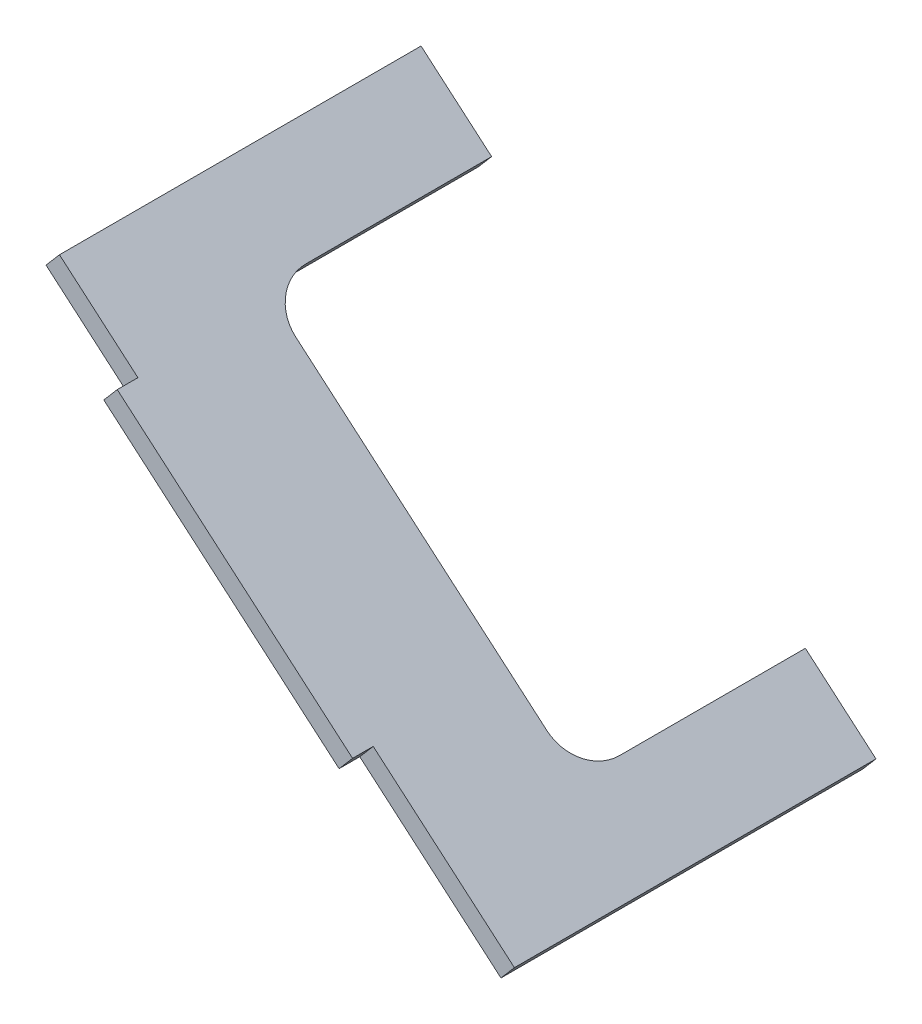
ISO-10303-21;
HEADER;
FILE_DESCRIPTION(('STEP AP214'),'2;1');
FILE_NAME('part.step','',(''),(''),'','','');
FILE_SCHEMA(('AUTOMOTIVE_DESIGN { 1 0 10303 214 1 1 1 1 }'));
ENDSEC;
DATA;
#1=APPLICATION_CONTEXT('core data for automotive mechanical design processes');
#2=APPLICATION_PROTOCOL_DEFINITION('international standard','automotive_design',2000,#1);
#3=PRODUCT_CONTEXT('',#1,'mechanical');
#4=PRODUCT('Part','Part','',(#3));
#5=PRODUCT_RELATED_PRODUCT_CATEGORY('part','',(#4));
#6=PRODUCT_DEFINITION_FORMATION('','',#4);
#7=PRODUCT_DEFINITION_CONTEXT('part definition',#1,'design');
#8=PRODUCT_DEFINITION('design','',#6,#7);
#9=PRODUCT_DEFINITION_SHAPE('','',#8);
#10=(LENGTH_UNIT() NAMED_UNIT(*) SI_UNIT(.MILLI.,.METRE.));
#11=(NAMED_UNIT(*) PLANE_ANGLE_UNIT() SI_UNIT($,.RADIAN.));
#12=(NAMED_UNIT(*) SI_UNIT($,.STERADIAN.) SOLID_ANGLE_UNIT());
#13=UNCERTAINTY_MEASURE_WITH_UNIT(LENGTH_MEASURE(1.E-05),#10,'distance_accuracy_value','');
#14=(GEOMETRIC_REPRESENTATION_CONTEXT(3) GLOBAL_UNCERTAINTY_ASSIGNED_CONTEXT((#13)) GLOBAL_UNIT_ASSIGNED_CONTEXT((#10,
#11,#12)) REPRESENTATION_CONTEXT('',''));
#15=CARTESIAN_POINT('',(0.,0.,0.));
#16=DIRECTION('',(0.,0.,1.));
#17=DIRECTION('',(1.,0.,0.));
#18=AXIS2_PLACEMENT_3D('',#15,#16,#17);
#19=CARTESIAN_POINT('',(-143.999999999999,-1.79066830807706E-12,-35.));
#20=DIRECTION('',(0.,0.,1.));
#21=DIRECTION('',(0.,1.,0.));
#22=AXIS2_PLACEMENT_3D('',#19,#20,#21);
#23=PLANE('',#22);
#24=DIRECTION('',(-0.759272473775862,0.650772856353339,0.));
#25=VECTOR('',#24,1.);
#26=CARTESIAN_POINT('',(30.6663228878355,65.0384694265857,-35.));
#27=LINE('',#26,#25);
#28=CARTESIAN_POINT('',(29.9070504140597,65.6892422829391,-35.));
#29=VERTEX_POINT('',#28);
#30=CARTESIAN_POINT('',(23.0735981500769,71.5461979901191,-35.));
#31=VERTEX_POINT('',#30);
#32=EDGE_CURVE('E246',#29,#31,#27,.T.);
#33=ORIENTED_EDGE('',*,*,#32,.T.);
#34=DIRECTION('',(-0.650772856353339,-0.759272473775862,0.));
#35=VECTOR('',#34,1.);
#36=CARTESIAN_POINT('',(49.9878306813736,102.947685796981,-35.));
#37=LINE('',#36,#35);
#38=CARTESIAN_POINT('',(24.3751438627836,73.0647429376708,-35.));
#39=VERTEX_POINT('',#38);
#40=EDGE_CURVE('E155',#39,#31,#37,.T.);
#41=ORIENTED_EDGE('',*,*,#40,.F.);
#42=DIRECTION('',(0.759272473775862,-0.650772856353339,0.));
#43=VECTOR('',#42,1.);
#44=CARTESIAN_POINT('',(54.746042813818,47.0338286835373,-35.));
#45=LINE('',#44,#43);
#46=CARTESIAN_POINT('',(31.2085961267664,67.2077872304908,-35.));
#47=VERTEX_POINT('',#46);
#48=EDGE_CURVE('E138',#39,#47,#45,.T.);
#49=ORIENTED_EDGE('',*,*,#48,.T.);
#50=DIRECTION('',(0.650772856353339,0.759272473775862,0.));
#51=VECTOR('',#50,1.);
#52=CARTESIAN_POINT('',(-76.2014777581834,-58.1101508348213,-35.));
#53=LINE('',#52,#51);
#54=EDGE_CURVE('E144',#29,#47,#53,.T.);
#55=ORIENTED_EDGE('',*,*,#54,.F.);
#56=EDGE_LOOP('',(#33,#41,#49,#55));
#57=FACE_BOUND('',#56,.T.);
#58=ADVANCED_FACE('F35',(#57),#23,.F.);
#59=CARTESIAN_POINT('',(31.9678686005422,66.5570143741374,-66.9779195690136));
#60=DIRECTION('',(0.759272473775864,-0.650772856353336,0.));
#61=DIRECTION('',(0.650772856353336,0.759272473775864,0.));
#62=AXIS2_PLACEMENT_3D('',#59,#60,#61);
#63=PLANE('',#62);
#64=DIRECTION('',(-0.650772856353339,-0.759272473775862,0.));
#65=VECTOR('',#64,1.);
#66=CARTESIAN_POINT('',(57.5805554191322,96.4399572334481,0.));
#67=LINE('',#66,#65);
#68=CARTESIAN_POINT('',(31.9678686005422,66.5570143741374,0.));
#69=VERTEX_POINT('',#68);
#70=CARTESIAN_POINT('',(30.6663228878355,65.0384694265857,0.));
#71=VERTEX_POINT('',#70);
#72=EDGE_CURVE('E199',#69,#71,#67,.T.);
#73=ORIENTED_EDGE('',*,*,#72,.T.);
#74=DIRECTION('',(0.,0.,1.));
#75=VECTOR('',#74,1.);
#76=CARTESIAN_POINT('',(30.6663228878355,65.0384694265857,-66.9779195690136));
#77=LINE('',#76,#75);
#78=CARTESIAN_POINT('',(30.6663228878355,65.0384694265857,1.99999999999999));
#79=VERTEX_POINT('',#78);
#80=EDGE_CURVE('E174',#71,#79,#77,.T.);
#81=ORIENTED_EDGE('',*,*,#80,.T.);
#82=DIRECTION('',(-0.650772856353336,-0.759272473775864,0.));
#83=VECTOR('',#82,1.);
#84=CARTESIAN_POINT('',(31.9678686005422,66.5570143741374,1.99999999999999));
#85=LINE('',#84,#83);
#86=CARTESIAN_POINT('',(31.9678686005422,66.5570143741374,1.99999999999999));
#87=VERTEX_POINT('',#86);
#88=EDGE_CURVE('E163',#87,#79,#85,.T.);
#89=ORIENTED_EDGE('',*,*,#88,.F.);
#90=DIRECTION('',(0.,0.,1.));
#91=VECTOR('',#90,1.);
#92=CARTESIAN_POINT('',(31.9678686005422,66.5570143741374,-66.9779195690136));
#93=LINE('',#92,#91);
#94=EDGE_CURVE('E212',#69,#87,#93,.T.);
#95=ORIENTED_EDGE('',*,*,#94,.F.);
#96=EDGE_LOOP('',(#73,#81,#89,#95));
#97=FACE_BOUND('',#96,.T.);
#98=ADVANCED_FACE('F249',(#97),#63,.F.);
#99=CARTESIAN_POINT('',(30.6663228878355,65.0384694265857,-66.9779195690136));
#100=DIRECTION('',(0.650772856353339,0.759272473775862,0.));
#101=DIRECTION('',(-0.759272473775862,0.650772856353339,0.));
#102=AXIS2_PLACEMENT_3D('',#99,#100,#101);
#103=PLANE('',#102);
#104=DIRECTION('',(0.,0.,1.));
#105=VECTOR('',#104,1.);
#106=CARTESIAN_POINT('',(60.2779493650941,39.6583280288055,-66.9779195690136));
#107=LINE('',#106,#105);
#108=CARTESIAN_POINT('',(60.2779493650942,39.6583280288055,-35.));
#109=VERTEX_POINT('',#108);
#110=CARTESIAN_POINT('',(60.2779493650941,39.6583280288055,-17.));
#111=VERTEX_POINT('',#110);
#112=EDGE_CURVE('E299',#109,#111,#107,.T.);
#113=ORIENTED_EDGE('',*,*,#112,.F.);
#114=CARTESIAN_POINT('',(67.1114016290769,33.8013723216254,-35.));
#115=VERTEX_POINT('',#114);
#116=EDGE_CURVE('E160',#115,#109,#27,.T.);
#117=ORIENTED_EDGE('',*,*,#116,.F.);
#118=DIRECTION('',(0.,0.,-1.));
#119=VECTOR('',#118,1.);
#120=CARTESIAN_POINT('',(67.1114016290769,33.8013723216254,0.));
#121=LINE('',#120,#119);
#122=CARTESIAN_POINT('',(67.1114016290769,33.8013723216254,0.));
#123=VERTEX_POINT('',#122);
#124=EDGE_CURVE('E182',#123,#115,#121,.T.);
#125=ORIENTED_EDGE('',*,*,#124,.F.);
#126=DIRECTION('',(0.759272473775862,-0.650772856353339,0.));
#127=VECTOR('',#126,1.);
#128=CARTESIAN_POINT('',(53.4444971011114,45.5152837359855,0.));
#129=LINE('',#128,#127);
#130=CARTESIAN_POINT('',(53.4444971011114,45.5152837359855,0.));
#131=VERTEX_POINT('',#130);
#132=EDGE_CURVE('E179',#131,#123,#129,.T.);
#133=ORIENTED_EDGE('',*,*,#132,.F.);
#134=DIRECTION('',(0.,0.,1.));
#135=VECTOR('',#134,1.);
#136=CARTESIAN_POINT('',(53.4444971011114,45.5152837359855,-66.9779195690136));
#137=LINE('',#136,#135);
#138=CARTESIAN_POINT('',(53.4444971011114,45.5152837359855,1.99999999999999));
#139=VERTEX_POINT('',#138);
#140=EDGE_CURVE('E170',#131,#139,#137,.T.);
#141=ORIENTED_EDGE('',*,*,#140,.T.);
#142=DIRECTION('',(0.759272473775862,-0.650772856353339,0.));
#143=VECTOR('',#142,1.);
#144=CARTESIAN_POINT('',(30.6663228878355,65.0384694265857,1.99999999999999));
#145=LINE('',#144,#143);
#146=EDGE_CURVE('E227',#79,#139,#145,.T.);
#147=ORIENTED_EDGE('',*,*,#146,.F.);
#148=ORIENTED_EDGE('',*,*,#80,.F.);
#149=DIRECTION('',(0.759272473775862,-0.650772856353338,0.));
#150=VECTOR('',#149,1.);
#151=CARTESIAN_POINT('',(30.6663228878355,65.0384694265857,0.));
#152=LINE('',#151,#150);
#153=CARTESIAN_POINT('',(23.0735981500769,71.5461979901191,0.));
#154=VERTEX_POINT('',#153);
#155=EDGE_CURVE('E203',#154,#71,#152,.T.);
#156=ORIENTED_EDGE('',*,*,#155,.F.);
#157=DIRECTION('',(0.,0.,1.));
#158=VECTOR('',#157,1.);
#159=CARTESIAN_POINT('',(23.0735981500769,71.5461979901191,0.));
#160=LINE('',#159,#158);
#161=EDGE_CURVE('E200',#31,#154,#160,.T.);
#162=ORIENTED_EDGE('',*,*,#161,.F.);
#163=ORIENTED_EDGE('',*,*,#32,.F.);
#164=DIRECTION('',(0.,0.,-1.));
#165=VECTOR('',#164,1.);
#166=CARTESIAN_POINT('',(29.9070504140597,65.689242282939,-66.9779195690136));
#167=LINE('',#166,#165);
#168=CARTESIAN_POINT('',(29.9070504140597,65.689242282939,-17.));
#169=VERTEX_POINT('',#168);
#170=EDGE_CURVE('E147',#169,#29,#167,.T.);
#171=ORIENTED_EDGE('',*,*,#170,.F.);
#172=CARTESIAN_POINT('',(32.9441403091631,63.0861508575257,-17.));
#173=DIRECTION('',(-0.650772856353339,-0.759272473775862,0.));
#174=DIRECTION('',(-0.759272473775862,0.650772856353339,0.));
#175=AXIS2_PLACEMENT_3D('',#172,#173,#174);
#176=CIRCLE('',#175,4.);
#177=CARTESIAN_POINT('',(32.9441403091631,63.0861508575257,-13.));
#178=VERTEX_POINT('',#177);
#179=EDGE_CURVE('E11',#178,#169,#176,.T.);
#180=ORIENTED_EDGE('',*,*,#179,.F.);
#181=DIRECTION('',(-0.759272473775862,0.650772856353339,0.));
#182=VECTOR('',#181,1.);
#183=CARTESIAN_POINT('',(30.6663228878355,65.0384694265857,-13.));
#184=LINE('',#183,#182);
#185=CARTESIAN_POINT('',(57.2408594699907,42.2614194542188,-13.));
#186=VERTEX_POINT('',#185);
#187=EDGE_CURVE('E183',#186,#178,#184,.T.);
#188=ORIENTED_EDGE('',*,*,#187,.F.);
#189=CARTESIAN_POINT('',(57.2408594699907,42.2614194542188,-17.));
#190=DIRECTION('',(-0.650772856353339,-0.759272473775862,0.));
#191=DIRECTION('',(-0.759272473775862,0.650772856353339,0.));
#192=AXIS2_PLACEMENT_3D('',#189,#190,#191);
#193=CIRCLE('',#192,4.);
#194=EDGE_CURVE('E302',#111,#186,#193,.T.);
#195=ORIENTED_EDGE('',*,*,#194,.F.);
#196=EDGE_LOOP('',(#113,#117,#125,#133,#141,#147,#148,#156,#162,#163,#171,#180,#188,#195));
#197=FACE_BOUND('',#196,.T.);
#198=ADVANCED_FACE('F239',(#197),#103,.F.);
#199=CARTESIAN_POINT('',(54.746042813818,47.0338286835373,-66.9779195690136));
#200=DIRECTION('',(-0.650772856353338,-0.759272473775862,0.));
#201=DIRECTION('',(0.759272473775862,-0.650772856353339,0.));
#202=AXIS2_PLACEMENT_3D('',#199,#200,#201);
#203=PLANE('',#202);
#204=ORIENTED_EDGE('',*,*,#48,.F.);
#205=DIRECTION('',(0.,0.,-1.));
#206=VECTOR('',#205,1.);
#207=CARTESIAN_POINT('',(24.3751438627836,73.0647429376708,0.));
#208=LINE('',#207,#206);
#209=CARTESIAN_POINT('',(24.3751438627836,73.0647429376708,0.));
#210=VERTEX_POINT('',#209);
#211=EDGE_CURVE('E196',#210,#39,#208,.T.);
#212=ORIENTED_EDGE('',*,*,#211,.F.);
#213=DIRECTION('',(-0.759272473775862,0.650772856353339,0.));
#214=VECTOR('',#213,1.);
#215=CARTESIAN_POINT('',(31.9678686005422,66.5570143741374,0.));
#216=LINE('',#215,#214);
#217=EDGE_CURVE('E198',#69,#210,#216,.T.);
#218=ORIENTED_EDGE('',*,*,#217,.F.);
#219=ORIENTED_EDGE('',*,*,#94,.T.);
#220=DIRECTION('',(-0.759272473775862,0.650772856353339,0.));
#221=VECTOR('',#220,1.);
#222=CARTESIAN_POINT('',(54.746042813818,47.0338286835373,1.99999999999999));
#223=LINE('',#222,#221);
#224=CARTESIAN_POINT('',(54.746042813818,47.0338286835373,1.99999999999999));
#225=VERTEX_POINT('',#224);
#226=EDGE_CURVE('E218',#225,#87,#223,.T.);
#227=ORIENTED_EDGE('',*,*,#226,.F.);
#228=DIRECTION('',(0.,0.,1.));
#229=VECTOR('',#228,1.);
#230=CARTESIAN_POINT('',(54.746042813818,47.0338286835373,-66.9779195690136));
#231=LINE('',#230,#229);
#232=CARTESIAN_POINT('',(54.7460428138181,47.0338286835372,0.));
#233=VERTEX_POINT('',#232);
#234=EDGE_CURVE('E176',#233,#225,#231,.T.);
#235=ORIENTED_EDGE('',*,*,#234,.F.);
#236=DIRECTION('',(-0.759272473775862,0.650772856353339,0.));
#237=VECTOR('',#236,1.);
#238=CARTESIAN_POINT('',(54.7460428138181,47.0338286835372,0.));
#239=LINE('',#238,#237);
#240=CARTESIAN_POINT('',(68.4129473417836,35.3199172691771,0.));
#241=VERTEX_POINT('',#240);
#242=EDGE_CURVE('E190',#241,#233,#239,.T.);
#243=ORIENTED_EDGE('',*,*,#242,.F.);
#244=DIRECTION('',(0.,0.,1.));
#245=VECTOR('',#244,1.);
#246=CARTESIAN_POINT('',(68.4129473417836,35.3199172691772,0.));
#247=LINE('',#246,#245);
#248=CARTESIAN_POINT('',(68.4129473417836,35.3199172691772,-35.));
#249=VERTEX_POINT('',#248);
#250=EDGE_CURVE('E291',#249,#241,#247,.T.);
#251=ORIENTED_EDGE('',*,*,#250,.F.);
#252=CARTESIAN_POINT('',(61.5794950778008,41.1768729763572,-35.));
#253=VERTEX_POINT('',#252);
#254=EDGE_CURVE('E156',#253,#249,#45,.T.);
#255=ORIENTED_EDGE('',*,*,#254,.F.);
#256=DIRECTION('',(0.,0.,1.));
#257=VECTOR('',#256,1.);
#258=CARTESIAN_POINT('',(61.5794950778008,41.1768729763572,-35.));
#259=LINE('',#258,#257);
#260=CARTESIAN_POINT('',(61.5794950778008,41.1768729763572,-17.));
#261=VERTEX_POINT('',#260);
#262=EDGE_CURVE('E141',#253,#261,#259,.T.);
#263=ORIENTED_EDGE('',*,*,#262,.T.);
#264=CARTESIAN_POINT('',(58.5424051826974,43.7799644017706,-17.));
#265=DIRECTION('',(0.650772856353338,0.759272473775862,0.));
#266=DIRECTION('',(0.759272473775862,-0.650772856353339,0.));
#267=AXIS2_PLACEMENT_3D('',#264,#265,#266);
#268=CIRCLE('',#267,4.);
#269=CARTESIAN_POINT('',(58.5424051826974,43.7799644017706,-13.));
#270=VERTEX_POINT('',#269);
#271=EDGE_CURVE('E310',#270,#261,#268,.T.);
#272=ORIENTED_EDGE('',*,*,#271,.F.);
#273=DIRECTION('',(-0.759272473775862,0.650772856353338,0.));
#274=VECTOR('',#273,1.);
#275=CARTESIAN_POINT('',(31.2085961267664,67.2077872304908,-13.));
#276=LINE('',#275,#274);
#277=CARTESIAN_POINT('',(34.2456860218698,64.6046958050774,-13.));
#278=VERTEX_POINT('',#277);
#279=EDGE_CURVE('E304',#270,#278,#276,.T.);
#280=ORIENTED_EDGE('',*,*,#279,.T.);
#281=CARTESIAN_POINT('',(34.2456860218698,64.6046958050774,-17.));
#282=DIRECTION('',(0.650772856353338,0.759272473775862,0.));
#283=DIRECTION('',(0.759272473775862,-0.650772856353339,0.));
#284=AXIS2_PLACEMENT_3D('',#281,#282,#283);
#285=CIRCLE('',#284,4.);
#286=CARTESIAN_POINT('',(31.2085961267664,67.2077872304908,-17.));
#287=VERTEX_POINT('',#286);
#288=EDGE_CURVE('E43',#287,#278,#285,.T.);
#289=ORIENTED_EDGE('',*,*,#288,.F.);
#290=DIRECTION('',(0.,0.,-1.));
#291=VECTOR('',#290,1.);
#292=CARTESIAN_POINT('',(31.2085961267664,67.2077872304908,-35.));
#293=LINE('',#292,#291);
#294=EDGE_CURVE('E133',#287,#47,#293,.T.);
#295=ORIENTED_EDGE('',*,*,#294,.T.);
#296=EDGE_LOOP('',(#204,#212,#218,#219,#227,#235,#243,#251,#255,#263,#272,#280,#289,#295));
#297=FACE_BOUND('',#296,.T.);
#298=ADVANCED_FACE('F135',(#297),#203,.F.);
#299=CARTESIAN_POINT('',(53.4444971011114,45.5152837359855,-66.9779195690136));
#300=DIRECTION('',(-0.759272473775869,0.650772856353331,0.));
#301=DIRECTION('',(-0.650772856353331,-0.759272473775869,0.));
#302=AXIS2_PLACEMENT_3D('',#299,#300,#301);
#303=PLANE('',#302);
#304=ORIENTED_EDGE('',*,*,#234,.T.);
#305=DIRECTION('',(0.650772856353331,0.759272473775868,0.));
#306=VECTOR('',#305,1.);
#307=CARTESIAN_POINT('',(53.4444971011114,45.5152837359855,1.99999999999999));
#308=LINE('',#307,#306);
#309=EDGE_CURVE('E175',#139,#225,#308,.T.);
#310=ORIENTED_EDGE('',*,*,#309,.F.);
#311=ORIENTED_EDGE('',*,*,#140,.F.);
#312=DIRECTION('',(-0.650772856353339,-0.759272473775862,0.));
#313=VECTOR('',#312,1.);
#314=CARTESIAN_POINT('',(80.358729632408,76.9167715428479,0.));
#315=LINE('',#314,#313);
#316=EDGE_CURVE('E186',#233,#131,#315,.T.);
#317=ORIENTED_EDGE('',*,*,#316,.F.);
#318=EDGE_LOOP('',(#304,#310,#311,#317));
#319=FACE_BOUND('',#318,.T.);
#320=ADVANCED_FACE('F242',(#319),#303,.F.);
#321=ORIENTED_EDGE('',*,*,#254,.T.);
#322=DIRECTION('',(-0.650772856353339,-0.759272473775862,0.));
#323=VECTOR('',#322,1.);
#324=CARTESIAN_POINT('',(94.0256341603735,65.2028601284878,-35.));
#325=LINE('',#324,#323);
#326=EDGE_CURVE('E286',#249,#115,#325,.T.);
#327=ORIENTED_EDGE('',*,*,#326,.T.);
#328=ORIENTED_EDGE('',*,*,#116,.T.);
#329=DIRECTION('',(-0.650772856353339,-0.759272473775862,0.));
#330=VECTOR('',#329,1.);
#331=CARTESIAN_POINT('',(-45.8305788071489,-84.1410650889548,-35.));
#332=LINE('',#331,#330);
#333=EDGE_CURVE('E152',#253,#109,#332,.T.);
#334=ORIENTED_EDGE('',*,*,#333,.F.);
#335=EDGE_LOOP('',(#321,#327,#328,#334));
#336=FACE_BOUND('',#335,.T.);
#337=ADVANCED_FACE('F269',(#336),#23,.F.);
#338=CARTESIAN_POINT('',(6.93889390390723E-13,-1.77548947766226E-12,1.99999999999999));
#339=DIRECTION('',(0.,0.,1.));
#340=DIRECTION('',(-1.,0.,0.));
#341=AXIS2_PLACEMENT_3D('',#338,#339,#340);
#342=PLANE('',#341);
#343=ORIENTED_EDGE('',*,*,#309,.T.);
#344=ORIENTED_EDGE('',*,*,#226,.T.);
#345=ORIENTED_EDGE('',*,*,#88,.T.);
#346=ORIENTED_EDGE('',*,*,#146,.T.);
#347=EDGE_LOOP('',(#343,#344,#345,#346));
#348=FACE_BOUND('',#347,.T.);
#349=ADVANCED_FACE('F230',(#348),#342,.T.);
#350=CARTESIAN_POINT('',(57.5805554191322,96.4399572334481,0.));
#351=DIRECTION('',(0.,0.,1.));
#352=DIRECTION('',(-1.,0.,0.));
#353=AXIS2_PLACEMENT_3D('',#350,#351,#352);
#354=PLANE('',#353);
#355=ORIENTED_EDGE('',*,*,#217,.T.);
#356=DIRECTION('',(-0.650772856353339,-0.759272473775862,0.));
#357=VECTOR('',#356,1.);
#358=CARTESIAN_POINT('',(49.9878306813736,102.947685796981,0.));
#359=LINE('',#358,#357);
#360=EDGE_CURVE('E206',#210,#154,#359,.T.);
#361=ORIENTED_EDGE('',*,*,#360,.T.);
#362=ORIENTED_EDGE('',*,*,#155,.T.);
#363=ORIENTED_EDGE('',*,*,#72,.F.);
#364=EDGE_LOOP('',(#355,#361,#362,#363));
#365=FACE_BOUND('',#364,.T.);
#366=ADVANCED_FACE('F260',(#365),#354,.T.);
#367=CARTESIAN_POINT('',(49.9878306813736,102.947685796981,0.));
#368=DIRECTION('',(-0.759272473775862,0.650772856353339,0.));
#369=DIRECTION('',(-0.650772856353339,-0.759272473775862,0.));
#370=AXIS2_PLACEMENT_3D('',#367,#368,#369);
#371=PLANE('',#370);
#372=ORIENTED_EDGE('',*,*,#211,.T.);
#373=ORIENTED_EDGE('',*,*,#40,.T.);
#374=ORIENTED_EDGE('',*,*,#161,.T.);
#375=ORIENTED_EDGE('',*,*,#360,.F.);
#376=EDGE_LOOP('',(#372,#373,#374,#375));
#377=FACE_BOUND('',#376,.T.);
#378=ADVANCED_FACE('F259',(#377),#371,.T.);
#379=CARTESIAN_POINT('',(94.0256341603735,65.2028601284878,0.));
#380=DIRECTION('',(0.759272473775862,-0.650772856353339,0.));
#381=DIRECTION('',(0.650772856353339,0.759272473775862,0.));
#382=AXIS2_PLACEMENT_3D('',#379,#380,#381);
#383=PLANE('',#382);
#384=ORIENTED_EDGE('',*,*,#250,.T.);
#385=DIRECTION('',(-0.650772856353339,-0.759272473775862,0.));
#386=VECTOR('',#385,1.);
#387=CARTESIAN_POINT('',(94.0256341603735,65.2028601284878,0.));
#388=LINE('',#387,#386);
#389=EDGE_CURVE('E189',#241,#123,#388,.T.);
#390=ORIENTED_EDGE('',*,*,#389,.T.);
#391=ORIENTED_EDGE('',*,*,#124,.T.);
#392=ORIENTED_EDGE('',*,*,#326,.F.);
#393=EDGE_LOOP('',(#384,#390,#391,#392));
#394=FACE_BOUND('',#393,.T.);
#395=ADVANCED_FACE('F267',(#394),#383,.T.);
#396=CARTESIAN_POINT('',(80.358729632408,76.9167715428479,0.));
#397=DIRECTION('',(0.,0.,1.));
#398=DIRECTION('',(-1.,0.,0.));
#399=AXIS2_PLACEMENT_3D('',#396,#397,#398);
#400=PLANE('',#399);
#401=ORIENTED_EDGE('',*,*,#242,.T.);
#402=ORIENTED_EDGE('',*,*,#316,.T.);
#403=ORIENTED_EDGE('',*,*,#132,.T.);
#404=ORIENTED_EDGE('',*,*,#389,.F.);
#405=EDGE_LOOP('',(#401,#402,#403,#404));
#406=FACE_BOUND('',#405,.T.);
#407=ADVANCED_FACE('F328',(#406),#400,.T.);
#408=CARTESIAN_POINT('',(24.700867563233,59.6150624927322,-13.));
#409=DIRECTION('',(0.,0.,1.));
#410=DIRECTION('',(-1.,0.,0.));
#411=AXIS2_PLACEMENT_3D('',#408,#409,#410);
#412=PLANE('',#411);
#413=ORIENTED_EDGE('',*,*,#187,.T.);
#414=DIRECTION('',(0.650772856353339,0.759272473775862,0.));
#415=VECTOR('',#414,1.);
#416=CARTESIAN_POINT('',(32.9441403091631,63.0861508575257,-13.));
#417=LINE('',#416,#415);
#418=EDGE_CURVE('E151',#278,#178,#417,.F.);
#419=ORIENTED_EDGE('',*,*,#418,.F.);
#420=ORIENTED_EDGE('',*,*,#279,.F.);
#421=DIRECTION('',(0.650772856353339,0.759272473775862,0.));
#422=VECTOR('',#421,1.);
#423=CARTESIAN_POINT('',(58.5424051826974,43.7799644017706,-13.));
#424=LINE('',#423,#422);
#425=EDGE_CURVE('E314',#186,#270,#424,.T.);
#426=ORIENTED_EDGE('',*,*,#425,.F.);
#427=EDGE_LOOP('',(#413,#419,#420,#426));
#428=FACE_BOUND('',#427,.T.);
#429=ADVANCED_FACE('F323',(#428),#412,.F.);
#430=CARTESIAN_POINT('',(24.700867563233,59.6150624927322,-35.));
#431=DIRECTION('',(-0.759272473775862,0.650772856353339,0.));
#432=DIRECTION('',(-0.650772856353339,-0.759272473775862,0.));
#433=AXIS2_PLACEMENT_3D('',#430,#431,#432);
#434=PLANE('',#433);
#435=ORIENTED_EDGE('',*,*,#170,.T.);
#436=ORIENTED_EDGE('',*,*,#54,.T.);
#437=ORIENTED_EDGE('',*,*,#294,.F.);
#438=DIRECTION('',(0.650772856353339,0.759272473775862,0.));
#439=VECTOR('',#438,1.);
#440=CARTESIAN_POINT('',(31.2085961267664,67.2077872304908,-17.));
#441=LINE('',#440,#439);
#442=EDGE_CURVE('E50',#169,#287,#441,.T.);
#443=ORIENTED_EDGE('',*,*,#442,.F.);
#444=EDGE_LOOP('',(#435,#436,#437,#443));
#445=FACE_BOUND('',#444,.T.);
#446=ADVANCED_FACE('F145',(#445),#434,.F.);
#447=CARTESIAN_POINT('',(55.0717665142674,33.5841482385986,-35.));
#448=DIRECTION('',(0.759272473775862,-0.650772856353339,0.));
#449=DIRECTION('',(0.650772856353339,0.759272473775862,0.));
#450=AXIS2_PLACEMENT_3D('',#447,#448,#449);
#451=PLANE('',#450);
#452=ORIENTED_EDGE('',*,*,#262,.F.);
#453=ORIENTED_EDGE('',*,*,#333,.T.);
#454=ORIENTED_EDGE('',*,*,#112,.T.);
#455=DIRECTION('',(0.650772856353339,0.759272473775862,0.));
#456=VECTOR('',#455,1.);
#457=CARTESIAN_POINT('',(60.2779493650941,39.6583280288055,-17.));
#458=LINE('',#457,#456);
#459=EDGE_CURVE('E312',#261,#111,#458,.F.);
#460=ORIENTED_EDGE('',*,*,#459,.F.);
#461=EDGE_LOOP('',(#452,#453,#454,#460));
#462=FACE_BOUND('',#461,.T.);
#463=ADVANCED_FACE('F311',(#462),#451,.F.);
#464=CARTESIAN_POINT('',(52.034676619164,36.187239664012,-17.));
#465=DIRECTION('',(-0.650772856353339,-0.759272473775862,0.));
#466=DIRECTION('',(0.759272473775862,-0.650772856353339,0.));
#467=AXIS2_PLACEMENT_3D('',#464,#465,#466);
#468=CYLINDRICAL_SURFACE('',#467,4.);
#469=ORIENTED_EDGE('',*,*,#194,.T.);
#470=ORIENTED_EDGE('',*,*,#425,.T.);
#471=ORIENTED_EDGE('',*,*,#271,.T.);
#472=ORIENTED_EDGE('',*,*,#459,.T.);
#473=EDGE_LOOP('',(#469,#470,#471,#472));
#474=FACE_BOUND('',#473,.T.);
#475=ADVANCED_FACE('F316',(#474),#468,.F.);
#476=CARTESIAN_POINT('',(27.7379574583364,57.0119710673188,-17.));
#477=DIRECTION('',(-0.650772856353339,-0.759272473775862,0.));
#478=DIRECTION('',(0.759272473775862,-0.650772856353339,0.));
#479=AXIS2_PLACEMENT_3D('',#476,#477,#478);
#480=CYLINDRICAL_SURFACE('',#479,4.);
#481=ORIENTED_EDGE('',*,*,#179,.T.);
#482=ORIENTED_EDGE('',*,*,#442,.T.);
#483=ORIENTED_EDGE('',*,*,#288,.T.);
#484=ORIENTED_EDGE('',*,*,#418,.T.);
#485=EDGE_LOOP('',(#481,#482,#483,#484));
#486=FACE_BOUND('',#485,.T.);
#487=ADVANCED_FACE('F37',(#486),#480,.F.);
#488=CLOSED_SHELL('',(#58,#98,#198,#298,#320,#337,#349,#366,#378,#395,#407,#429,#446,#463,#475,#487));
#489=MANIFOLD_SOLID_BREP('B2',#488);
#490=ADVANCED_BREP_SHAPE_REPRESENTATION('',(#18,#489),#14);
#491=SHAPE_DEFINITION_REPRESENTATION(#9,#490);
ENDSEC;
END-ISO-10303-21;
